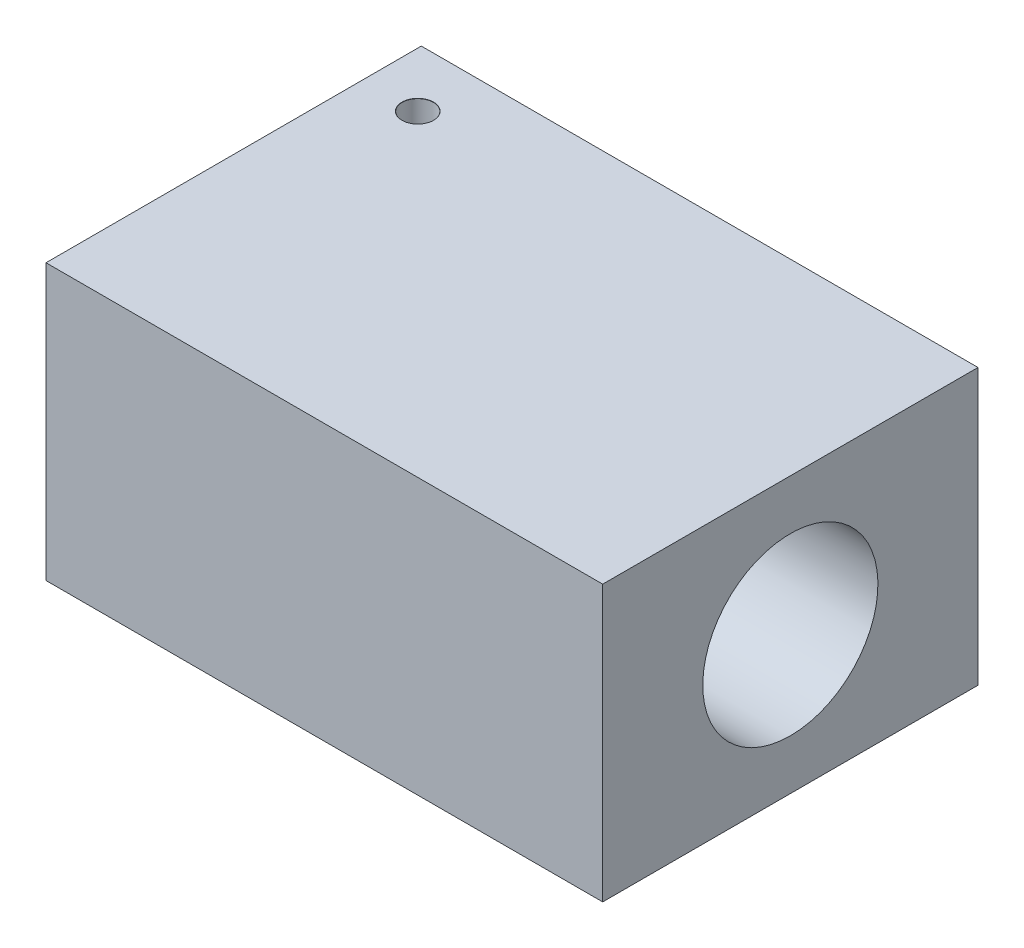
ISO-10303-21;
HEADER;
FILE_DESCRIPTION(('STEP AP214'),'2;1');
FILE_NAME('part.step','',(''),(''),'','','');
FILE_SCHEMA(('AUTOMOTIVE_DESIGN { 1 0 10303 214 1 1 1 1 }'));
ENDSEC;
DATA;
#1=APPLICATION_CONTEXT('core data for automotive mechanical design processes');
#2=APPLICATION_PROTOCOL_DEFINITION('international standard','automotive_design',2000,#1);
#3=PRODUCT_CONTEXT('',#1,'mechanical');
#4=PRODUCT('Part','Part','',(#3));
#5=PRODUCT_RELATED_PRODUCT_CATEGORY('part','',(#4));
#6=PRODUCT_DEFINITION_FORMATION('','',#4);
#7=PRODUCT_DEFINITION_CONTEXT('part definition',#1,'design');
#8=PRODUCT_DEFINITION('design','',#6,#7);
#9=PRODUCT_DEFINITION_SHAPE('','',#8);
#10=(LENGTH_UNIT() NAMED_UNIT(*) SI_UNIT(.MILLI.,.METRE.));
#11=(NAMED_UNIT(*) PLANE_ANGLE_UNIT() SI_UNIT($,.RADIAN.));
#12=(NAMED_UNIT(*) SI_UNIT($,.STERADIAN.) SOLID_ANGLE_UNIT());
#13=UNCERTAINTY_MEASURE_WITH_UNIT(LENGTH_MEASURE(1.E-05),#10,'distance_accuracy_value','');
#14=(GEOMETRIC_REPRESENTATION_CONTEXT(3) GLOBAL_UNCERTAINTY_ASSIGNED_CONTEXT((#13)) GLOBAL_UNIT_ASSIGNED_CONTEXT((#10,
#11,#12)) REPRESENTATION_CONTEXT('',''));
#15=CARTESIAN_POINT('',(0.,0.,0.));
#16=DIRECTION('',(0.,0.,1.));
#17=DIRECTION('',(1.,0.,0.));
#18=AXIS2_PLACEMENT_3D('',#15,#16,#17);
#19=CARTESIAN_POINT('',(44.5,22.,30.));
#20=DIRECTION('',(-1.,0.,0.));
#21=DIRECTION('',(0.,-1.,0.));
#22=AXIS2_PLACEMENT_3D('',#19,#20,#21);
#23=PLANE('',#22);
#24=CARTESIAN_POINT('',(44.5,0.,0.));
#25=DIRECTION('',(-1.,0.,0.));
#26=DIRECTION('',(0.,-1.,0.));
#27=AXIS2_PLACEMENT_3D('',#24,#25,#26);
#28=CIRCLE('',#27,14.);
#29=CARTESIAN_POINT('',(44.5,-14.,0.));
#30=VERTEX_POINT('',#29);
#31=EDGE_CURVE('E100',#30,#30,#28,.T.);
#32=ORIENTED_EDGE('',*,*,#31,.T.);
#33=EDGE_LOOP('',(#32));
#34=FACE_BOUND('',#33,.T.);
#35=DIRECTION('',(0.,1.,0.));
#36=VECTOR('',#35,1.);
#37=CARTESIAN_POINT('',(44.5,22.,-30.));
#38=LINE('',#37,#36);
#39=CARTESIAN_POINT('',(44.5,-22.,-30.));
#40=VERTEX_POINT('',#39);
#41=CARTESIAN_POINT('',(44.5,22.,-30.));
#42=VERTEX_POINT('',#41);
#43=EDGE_CURVE('E97',#40,#42,#38,.T.);
#44=ORIENTED_EDGE('',*,*,#43,.T.);
#45=DIRECTION('',(0.,0.,-1.));
#46=VECTOR('',#45,1.);
#47=CARTESIAN_POINT('',(44.5,22.,30.));
#48=LINE('',#47,#46);
#49=CARTESIAN_POINT('',(44.5,22.,30.));
#50=VERTEX_POINT('',#49);
#51=EDGE_CURVE('E11',#50,#42,#48,.T.);
#52=ORIENTED_EDGE('',*,*,#51,.F.);
#53=DIRECTION('',(0.,1.,0.));
#54=VECTOR('',#53,1.);
#55=CARTESIAN_POINT('',(44.5,22.,30.));
#56=LINE('',#55,#54);
#57=CARTESIAN_POINT('',(44.5,-22.,30.));
#58=VERTEX_POINT('',#57);
#59=EDGE_CURVE('E85',#58,#50,#56,.T.);
#60=ORIENTED_EDGE('',*,*,#59,.F.);
#61=DIRECTION('',(0.,0.,-1.));
#62=VECTOR('',#61,1.);
#63=CARTESIAN_POINT('',(44.5,-22.,30.));
#64=LINE('',#63,#62);
#65=EDGE_CURVE('E93',#58,#40,#64,.T.);
#66=ORIENTED_EDGE('',*,*,#65,.T.);
#67=EDGE_LOOP('',(#44,#52,#60,#66));
#68=FACE_BOUND('',#67,.T.);
#69=ADVANCED_FACE('F34',(#34,#68),#23,.F.);
#70=CARTESIAN_POINT('',(-44.5,22.,30.));
#71=DIRECTION('',(0.,-1.,0.));
#72=DIRECTION('',(0.,0.,-1.));
#73=AXIS2_PLACEMENT_3D('',#70,#71,#72);
#74=PLANE('',#73);
#75=CARTESIAN_POINT('',(-35.7598877341082,22.,-20.6960350261153));
#76=DIRECTION('',(0.,1.,0.));
#77=DIRECTION('',(0.,0.,1.));
#78=AXIS2_PLACEMENT_3D('',#75,#76,#77);
#79=CIRCLE('',#78,2.525);
#80=CARTESIAN_POINT('',(-35.7598877341082,22.,-18.1710350261153));
#81=VERTEX_POINT('',#80);
#82=EDGE_CURVE('E122',#81,#81,#79,.T.);
#83=ORIENTED_EDGE('',*,*,#82,.F.);
#84=EDGE_LOOP('',(#83));
#85=FACE_BOUND('',#84,.T.);
#86=DIRECTION('',(-1.,0.,0.));
#87=VECTOR('',#86,1.);
#88=CARTESIAN_POINT('',(-44.5,22.,-30.));
#89=LINE('',#88,#87);
#90=CARTESIAN_POINT('',(-44.5,22.,-30.));
#91=VERTEX_POINT('',#90);
#92=EDGE_CURVE('E89',#42,#91,#89,.T.);
#93=ORIENTED_EDGE('',*,*,#92,.T.);
#94=DIRECTION('',(0.,0.,-1.));
#95=VECTOR('',#94,1.);
#96=CARTESIAN_POINT('',(-44.5,22.,30.));
#97=LINE('',#96,#95);
#98=CARTESIAN_POINT('',(-44.5,22.,30.));
#99=VERTEX_POINT('',#98);
#100=EDGE_CURVE('E42',#99,#91,#97,.T.);
#101=ORIENTED_EDGE('',*,*,#100,.F.);
#102=DIRECTION('',(-1.,0.,0.));
#103=VECTOR('',#102,1.);
#104=CARTESIAN_POINT('',(-44.5,22.,30.));
#105=LINE('',#104,#103);
#106=EDGE_CURVE('E80',#50,#99,#105,.T.);
#107=ORIENTED_EDGE('',*,*,#106,.F.);
#108=ORIENTED_EDGE('',*,*,#51,.T.);
#109=EDGE_LOOP('',(#93,#101,#107,#108));
#110=FACE_BOUND('',#109,.T.);
#111=ADVANCED_FACE('F88',(#85,#110),#74,.F.);
#112=CARTESIAN_POINT('',(-44.5,22.,30.));
#113=DIRECTION('',(1.,0.,0.));
#114=DIRECTION('',(0.,1.,0.));
#115=AXIS2_PLACEMENT_3D('',#112,#113,#114);
#116=PLANE('',#115);
#117=CARTESIAN_POINT('',(-44.5,0.,0.));
#118=DIRECTION('',(-1.,0.,0.));
#119=DIRECTION('',(0.,-1.,0.));
#120=AXIS2_PLACEMENT_3D('',#117,#118,#119);
#121=CIRCLE('',#120,14.);
#122=CARTESIAN_POINT('',(-44.5,-14.,0.));
#123=VERTEX_POINT('',#122);
#124=EDGE_CURVE('E111',#123,#123,#121,.T.);
#125=ORIENTED_EDGE('',*,*,#124,.F.);
#126=EDGE_LOOP('',(#125));
#127=FACE_BOUND('',#126,.T.);
#128=DIRECTION('',(0.,-1.,0.));
#129=VECTOR('',#128,1.);
#130=CARTESIAN_POINT('',(-44.5,22.,-30.));
#131=LINE('',#130,#129);
#132=CARTESIAN_POINT('',(-44.5,-22.,-30.));
#133=VERTEX_POINT('',#132);
#134=EDGE_CURVE('E67',#91,#133,#131,.T.);
#135=ORIENTED_EDGE('',*,*,#134,.T.);
#136=DIRECTION('',(0.,0.,-1.));
#137=VECTOR('',#136,1.);
#138=CARTESIAN_POINT('',(-44.5,-22.,30.));
#139=LINE('',#138,#137);
#140=CARTESIAN_POINT('',(-44.5,-22.,30.));
#141=VERTEX_POINT('',#140);
#142=EDGE_CURVE('E90',#141,#133,#139,.T.);
#143=ORIENTED_EDGE('',*,*,#142,.F.);
#144=DIRECTION('',(0.,-1.,0.));
#145=VECTOR('',#144,1.);
#146=CARTESIAN_POINT('',(-44.5,22.,30.));
#147=LINE('',#146,#145);
#148=EDGE_CURVE('E83',#99,#141,#147,.T.);
#149=ORIENTED_EDGE('',*,*,#148,.F.);
#150=ORIENTED_EDGE('',*,*,#100,.T.);
#151=EDGE_LOOP('',(#135,#143,#149,#150));
#152=FACE_BOUND('',#151,.T.);
#153=ADVANCED_FACE('F91',(#127,#152),#116,.F.);
#154=CARTESIAN_POINT('',(-44.5,-22.,30.));
#155=DIRECTION('',(0.,1.,0.));
#156=DIRECTION('',(0.,0.,1.));
#157=AXIS2_PLACEMENT_3D('',#154,#155,#156);
#158=PLANE('',#157);
#159=CARTESIAN_POINT('',(-35.7598877341082,-22.,-20.6960350261153));
#160=DIRECTION('',(0.,1.,0.));
#161=DIRECTION('',(0.,0.,1.));
#162=AXIS2_PLACEMENT_3D('',#159,#160,#161);
#163=CIRCLE('',#162,2.5);
#164=CARTESIAN_POINT('',(-35.7598877341082,-22.,-18.1960350261153));
#165=VERTEX_POINT('',#164);
#166=EDGE_CURVE('E114',#165,#165,#163,.T.);
#167=ORIENTED_EDGE('',*,*,#166,.T.);
#168=EDGE_LOOP('',(#167));
#169=FACE_BOUND('',#168,.T.);
#170=DIRECTION('',(1.,0.,0.));
#171=VECTOR('',#170,1.);
#172=CARTESIAN_POINT('',(-44.5,-22.,-30.));
#173=LINE('',#172,#171);
#174=EDGE_CURVE('E73',#133,#40,#173,.T.);
#175=ORIENTED_EDGE('',*,*,#174,.T.);
#176=ORIENTED_EDGE('',*,*,#65,.F.);
#177=DIRECTION('',(1.,0.,0.));
#178=VECTOR('',#177,1.);
#179=CARTESIAN_POINT('',(-44.5,-22.,30.));
#180=LINE('',#179,#178);
#181=EDGE_CURVE('E50',#141,#58,#180,.T.);
#182=ORIENTED_EDGE('',*,*,#181,.F.);
#183=ORIENTED_EDGE('',*,*,#142,.T.);
#184=EDGE_LOOP('',(#175,#176,#182,#183));
#185=FACE_BOUND('',#184,.T.);
#186=ADVANCED_FACE('F105',(#169,#185),#158,.F.);
#187=CARTESIAN_POINT('',(0.,0.,30.));
#188=DIRECTION('',(0.,0.,1.));
#189=DIRECTION('',(1.,0.,0.));
#190=AXIS2_PLACEMENT_3D('',#187,#188,#189);
#191=PLANE('',#190);
#192=ORIENTED_EDGE('',*,*,#59,.T.);
#193=ORIENTED_EDGE('',*,*,#106,.T.);
#194=ORIENTED_EDGE('',*,*,#148,.T.);
#195=ORIENTED_EDGE('',*,*,#181,.T.);
#196=EDGE_LOOP('',(#192,#193,#194,#195));
#197=FACE_BOUND('',#196,.T.);
#198=ADVANCED_FACE('F81',(#197),#191,.T.);
#199=CARTESIAN_POINT('',(0.,0.,-30.));
#200=DIRECTION('',(0.,0.,1.));
#201=DIRECTION('',(1.,0.,0.));
#202=AXIS2_PLACEMENT_3D('',#199,#200,#201);
#203=PLANE('',#202);
#204=ORIENTED_EDGE('',*,*,#43,.F.);
#205=ORIENTED_EDGE('',*,*,#174,.F.);
#206=ORIENTED_EDGE('',*,*,#134,.F.);
#207=ORIENTED_EDGE('',*,*,#92,.F.);
#208=EDGE_LOOP('',(#204,#205,#206,#207));
#209=FACE_BOUND('',#208,.T.);
#210=ADVANCED_FACE('F108',(#209),#203,.F.);
#211=CARTESIAN_POINT('',(44.5,0.,0.));
#212=DIRECTION('',(-1.,0.,0.));
#213=DIRECTION('',(0.,-1.,0.));
#214=AXIS2_PLACEMENT_3D('',#211,#212,#213);
#215=CYLINDRICAL_SURFACE('',#214,14.);
#216=ORIENTED_EDGE('',*,*,#31,.F.);
#217=EDGE_LOOP('',(#216));
#218=FACE_BOUND('',#217,.T.);
#219=ORIENTED_EDGE('',*,*,#124,.T.);
#220=EDGE_LOOP('',(#219));
#221=FACE_BOUND('',#220,.T.);
#222=ADVANCED_FACE('F142',(#218,#221),#215,.F.);
#223=CARTESIAN_POINT('',(-35.7598877341082,22.,-20.6960350261153));
#224=DIRECTION('',(0.,1.,0.));
#225=DIRECTION('',(0.,0.,1.));
#226=AXIS2_PLACEMENT_3D('',#223,#224,#225);
#227=CYLINDRICAL_SURFACE('',#226,2.5);
#228=ORIENTED_EDGE('',*,*,#166,.F.);
#229=EDGE_LOOP('',(#228));
#230=FACE_BOUND('',#229,.T.);
#231=CARTESIAN_POINT('',(-35.7598877341082,21.975,-20.6960350261153));
#232=DIRECTION('',(0.,1.,0.));
#233=DIRECTION('',(0.,0.,1.));
#234=AXIS2_PLACEMENT_3D('',#231,#232,#233);
#235=CIRCLE('',#234,2.5);
#236=CARTESIAN_POINT('',(-35.7598877341082,21.975,-18.1960350261153));
#237=VERTEX_POINT('',#236);
#238=EDGE_CURVE('E119',#237,#237,#235,.T.);
#239=ORIENTED_EDGE('',*,*,#238,.T.);
#240=EDGE_LOOP('',(#239));
#241=FACE_BOUND('',#240,.T.);
#242=ADVANCED_FACE('F147',(#230,#241),#227,.F.);
#243=CARTESIAN_POINT('',(-35.7598877341082,22.,-20.6960350261153));
#244=DIRECTION('',(0.,1.,0.));
#245=DIRECTION('',(0.,0.,1.));
#246=AXIS2_PLACEMENT_3D('',#243,#244,#245);
#247=CONICAL_SURFACE('',#246,2.525,0.785398163397309);
#248=ORIENTED_EDGE('',*,*,#238,.F.);
#249=EDGE_LOOP('',(#248));
#250=FACE_BOUND('',#249,.T.);
#251=ORIENTED_EDGE('',*,*,#82,.T.);
#252=EDGE_LOOP('',(#251));
#253=FACE_BOUND('',#252,.T.);
#254=ADVANCED_FACE('F126',(#250,#253),#247,.F.);
#255=CLOSED_SHELL('',(#69,#111,#153,#186,#198,#210,#222,#242,#254));
#256=MANIFOLD_SOLID_BREP('B2',#255);
#257=ADVANCED_BREP_SHAPE_REPRESENTATION('',(#18,#256),#14);
#258=SHAPE_DEFINITION_REPRESENTATION(#9,#257);
ENDSEC;
END-ISO-10303-21;
